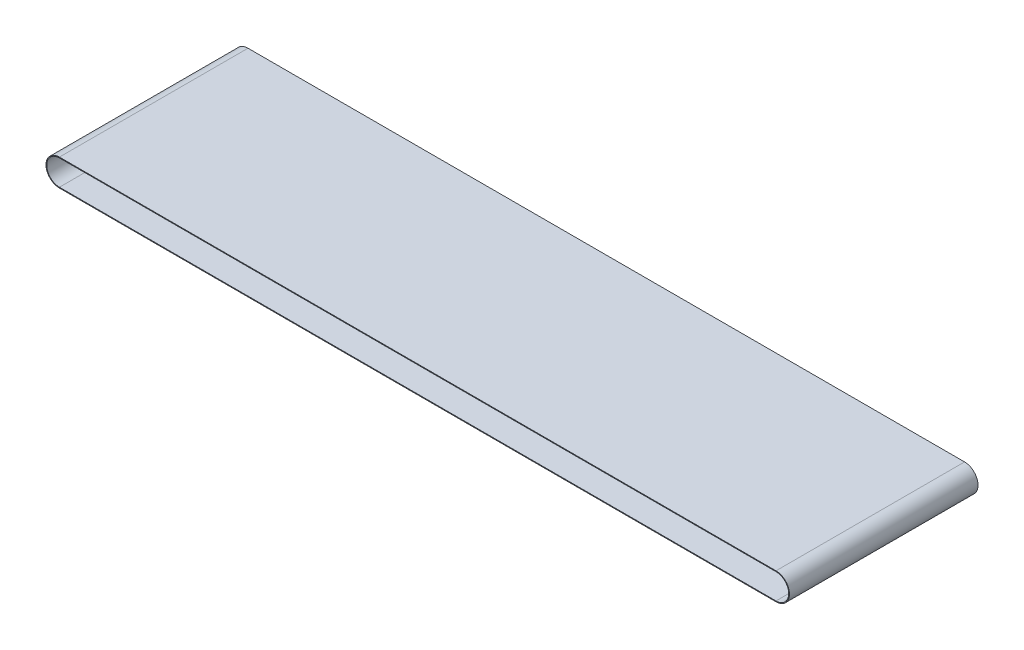
ISO-10303-21;
HEADER;
FILE_DESCRIPTION(('STEP AP214'),'2;1');
FILE_NAME('part.step','',(''),(''),'','','');
FILE_SCHEMA(('AUTOMOTIVE_DESIGN { 1 0 10303 214 1 1 1 1 }'));
ENDSEC;
DATA;
#1=APPLICATION_CONTEXT('core data for automotive mechanical design processes');
#2=APPLICATION_PROTOCOL_DEFINITION('international standard','automotive_design',2000,#1);
#3=PRODUCT_CONTEXT('',#1,'mechanical');
#4=PRODUCT('Part','Part','',(#3));
#5=PRODUCT_RELATED_PRODUCT_CATEGORY('part','',(#4));
#6=PRODUCT_DEFINITION_FORMATION('','',#4);
#7=PRODUCT_DEFINITION_CONTEXT('part definition',#1,'design');
#8=PRODUCT_DEFINITION('design','',#6,#7);
#9=PRODUCT_DEFINITION_SHAPE('','',#8);
#10=(LENGTH_UNIT() NAMED_UNIT(*) SI_UNIT(.MILLI.,.METRE.));
#11=(NAMED_UNIT(*) PLANE_ANGLE_UNIT() SI_UNIT($,.RADIAN.));
#12=(NAMED_UNIT(*) SI_UNIT($,.STERADIAN.) SOLID_ANGLE_UNIT());
#13=UNCERTAINTY_MEASURE_WITH_UNIT(LENGTH_MEASURE(1.E-05),#10,'distance_accuracy_value','');
#14=(GEOMETRIC_REPRESENTATION_CONTEXT(3) GLOBAL_UNCERTAINTY_ASSIGNED_CONTEXT((#13)) GLOBAL_UNIT_ASSIGNED_CONTEXT((#10,
#11,#12)) REPRESENTATION_CONTEXT('',''));
#15=CARTESIAN_POINT('',(0.,0.,0.));
#16=DIRECTION('',(0.,0.,1.));
#17=DIRECTION('',(1.,0.,0.));
#18=AXIS2_PLACEMENT_3D('',#15,#16,#17);
#19=CARTESIAN_POINT('',(0.,0.,-255.));
#20=DIRECTION('',(0.,0.,-1.));
#21=DIRECTION('',(-1.,0.,0.));
#22=AXIS2_PLACEMENT_3D('',#19,#20,#21);
#23=PLANE('',#22);
#24=CARTESIAN_POINT('',(0.,0.,-255.));
#25=DIRECTION('',(0.,0.,-1.));
#26=DIRECTION('',(-1.,0.,0.));
#27=AXIS2_PLACEMENT_3D('',#24,#25,#26);
#28=CIRCLE('',#27,17.8);
#29=CARTESIAN_POINT('',(0.,-17.8,-255.));
#30=VERTEX_POINT('',#29);
#31=CARTESIAN_POINT('',(0.,17.8,-255.));
#32=VERTEX_POINT('',#31);
#33=EDGE_CURVE('E168',#30,#32,#28,.T.);
#34=ORIENTED_EDGE('',*,*,#33,.T.);
#35=DIRECTION('',(1.,0.,0.));
#36=VECTOR('',#35,1.);
#37=CARTESIAN_POINT('',(0.,17.8,-255.));
#38=LINE('',#37,#36);
#39=CARTESIAN_POINT('',(950.,17.8,-255.));
#40=VERTEX_POINT('',#39);
#41=EDGE_CURVE('E171',#32,#40,#38,.T.);
#42=ORIENTED_EDGE('',*,*,#41,.T.);
#43=CARTESIAN_POINT('',(950.,0.,-255.));
#44=DIRECTION('',(0.,0.,-1.));
#45=DIRECTION('',(-1.,0.,0.));
#46=AXIS2_PLACEMENT_3D('',#43,#44,#45);
#47=CIRCLE('',#46,17.8);
#48=CARTESIAN_POINT('',(950.,-17.8,-255.));
#49=VERTEX_POINT('',#48);
#50=EDGE_CURVE('E174',#40,#49,#47,.T.);
#51=ORIENTED_EDGE('',*,*,#50,.T.);
#52=DIRECTION('',(-1.,0.,0.));
#53=VECTOR('',#52,1.);
#54=CARTESIAN_POINT('',(0.,-17.8,-255.));
#55=LINE('',#54,#53);
#56=EDGE_CURVE('E176',#49,#30,#55,.T.);
#57=ORIENTED_EDGE('',*,*,#56,.T.);
#58=EDGE_LOOP('',(#34,#42,#51,#57));
#59=FACE_BOUND('',#58,.T.);
#60=DIRECTION('',(1.,0.,0.));
#61=VECTOR('',#60,1.);
#62=CARTESIAN_POINT('',(0.,16.8,-255.));
#63=LINE('',#62,#61);
#64=CARTESIAN_POINT('',(0.,16.8,-255.));
#65=VERTEX_POINT('',#64);
#66=CARTESIAN_POINT('',(950.,16.8,-255.));
#67=VERTEX_POINT('',#66);
#68=EDGE_CURVE('E140',#65,#67,#63,.T.);
#69=ORIENTED_EDGE('',*,*,#68,.F.);
#70=CARTESIAN_POINT('',(0.,0.,-255.));
#71=DIRECTION('',(0.,0.,-1.));
#72=DIRECTION('',(-1.,0.,0.));
#73=AXIS2_PLACEMENT_3D('',#70,#71,#72);
#74=CIRCLE('',#73,16.8);
#75=CARTESIAN_POINT('',(0.,-16.8,-255.));
#76=VERTEX_POINT('',#75);
#77=EDGE_CURVE('E132',#76,#65,#74,.T.);
#78=ORIENTED_EDGE('',*,*,#77,.F.);
#79=DIRECTION('',(-1.,0.,0.));
#80=VECTOR('',#79,1.);
#81=CARTESIAN_POINT('',(950.,-16.8,-255.));
#82=LINE('',#81,#80);
#83=CARTESIAN_POINT('',(950.,-16.8,-255.));
#84=VERTEX_POINT('',#83);
#85=EDGE_CURVE('E154',#84,#76,#82,.T.);
#86=ORIENTED_EDGE('',*,*,#85,.F.);
#87=CARTESIAN_POINT('',(950.,0.,-255.));
#88=DIRECTION('',(0.,0.,-1.));
#89=DIRECTION('',(-1.,0.,0.));
#90=AXIS2_PLACEMENT_3D('',#87,#88,#89);
#91=CIRCLE('',#90,16.8);
#92=EDGE_CURVE('E152',#67,#84,#91,.T.);
#93=ORIENTED_EDGE('',*,*,#92,.F.);
#94=EDGE_LOOP('',(#69,#78,#86,#93));
#95=FACE_BOUND('',#94,.T.);
#96=ADVANCED_FACE('F67',(#59,#95),#23,.T.);
#97=CARTESIAN_POINT('',(0.,0.,-5.));
#98=DIRECTION('',(0.,0.,-1.));
#99=DIRECTION('',(-1.,0.,0.));
#100=AXIS2_PLACEMENT_3D('',#97,#98,#99);
#101=PLANE('',#100);
#102=CARTESIAN_POINT('',(0.,0.,-5.));
#103=DIRECTION('',(0.,0.,-1.));
#104=DIRECTION('',(-1.,0.,0.));
#105=AXIS2_PLACEMENT_3D('',#102,#103,#104);
#106=CIRCLE('',#105,17.8);
#107=CARTESIAN_POINT('',(0.,-17.8,-5.));
#108=VERTEX_POINT('',#107);
#109=CARTESIAN_POINT('',(0.,17.8,-5.));
#110=VERTEX_POINT('',#109);
#111=EDGE_CURVE('E148',#108,#110,#106,.T.);
#112=ORIENTED_EDGE('',*,*,#111,.F.);
#113=DIRECTION('',(-1.,0.,0.));
#114=VECTOR('',#113,1.);
#115=CARTESIAN_POINT('',(0.,-17.8,-5.));
#116=LINE('',#115,#114);
#117=CARTESIAN_POINT('',(950.,-17.8,-5.));
#118=VERTEX_POINT('',#117);
#119=EDGE_CURVE('E172',#118,#108,#116,.T.);
#120=ORIENTED_EDGE('',*,*,#119,.F.);
#121=CARTESIAN_POINT('',(950.,0.,-5.));
#122=DIRECTION('',(0.,0.,-1.));
#123=DIRECTION('',(-1.,0.,0.));
#124=AXIS2_PLACEMENT_3D('',#121,#122,#123);
#125=CIRCLE('',#124,17.8);
#126=CARTESIAN_POINT('',(950.,17.8,-5.));
#127=VERTEX_POINT('',#126);
#128=EDGE_CURVE('E183',#127,#118,#125,.T.);
#129=ORIENTED_EDGE('',*,*,#128,.F.);
#130=DIRECTION('',(1.,0.,0.));
#131=VECTOR('',#130,1.);
#132=CARTESIAN_POINT('',(0.,17.8,-5.));
#133=LINE('',#132,#131);
#134=EDGE_CURVE('E181',#110,#127,#133,.T.);
#135=ORIENTED_EDGE('',*,*,#134,.F.);
#136=EDGE_LOOP('',(#112,#120,#129,#135));
#137=FACE_BOUND('',#136,.T.);
#138=CARTESIAN_POINT('',(0.,0.,-5.));
#139=DIRECTION('',(0.,0.,-1.));
#140=DIRECTION('',(-1.,0.,0.));
#141=AXIS2_PLACEMENT_3D('',#138,#139,#140);
#142=CIRCLE('',#141,16.8);
#143=CARTESIAN_POINT('',(0.,-16.8,-5.));
#144=VERTEX_POINT('',#143);
#145=CARTESIAN_POINT('',(0.,16.8,-5.));
#146=VERTEX_POINT('',#145);
#147=EDGE_CURVE('E90',#144,#146,#142,.T.);
#148=ORIENTED_EDGE('',*,*,#147,.T.);
#149=DIRECTION('',(1.,0.,0.));
#150=VECTOR('',#149,1.);
#151=CARTESIAN_POINT('',(0.,16.8,-5.));
#152=LINE('',#151,#150);
#153=CARTESIAN_POINT('',(950.,16.8,-5.));
#154=VERTEX_POINT('',#153);
#155=EDGE_CURVE('E147',#146,#154,#152,.T.);
#156=ORIENTED_EDGE('',*,*,#155,.T.);
#157=CARTESIAN_POINT('',(950.,0.,-5.));
#158=DIRECTION('',(0.,0.,-1.));
#159=DIRECTION('',(-1.,0.,0.));
#160=AXIS2_PLACEMENT_3D('',#157,#158,#159);
#161=CIRCLE('',#160,16.8);
#162=CARTESIAN_POINT('',(950.,-16.8,-5.));
#163=VERTEX_POINT('',#162);
#164=EDGE_CURVE('E160',#154,#163,#161,.T.);
#165=ORIENTED_EDGE('',*,*,#164,.T.);
#166=DIRECTION('',(-1.,0.,0.));
#167=VECTOR('',#166,1.);
#168=CARTESIAN_POINT('',(950.,-16.8,-5.));
#169=LINE('',#168,#167);
#170=EDGE_CURVE('E141',#163,#144,#169,.T.);
#171=ORIENTED_EDGE('',*,*,#170,.T.);
#172=EDGE_LOOP('',(#148,#156,#165,#171));
#173=FACE_BOUND('',#172,.T.);
#174=ADVANCED_FACE('F201',(#137,#173),#101,.F.);
#175=CARTESIAN_POINT('',(0.,0.,-255.));
#176=DIRECTION('',(0.,0.,1.));
#177=DIRECTION('',(1.,0.,0.));
#178=AXIS2_PLACEMENT_3D('',#175,#176,#177);
#179=CYLINDRICAL_SURFACE('',#178,17.8);
#180=ORIENTED_EDGE('',*,*,#111,.T.);
#181=DIRECTION('',(0.,0.,1.));
#182=VECTOR('',#181,1.);
#183=CARTESIAN_POINT('',(0.,17.8,-255.));
#184=LINE('',#183,#182);
#185=EDGE_CURVE('E12',#32,#110,#184,.T.);
#186=ORIENTED_EDGE('',*,*,#185,.F.);
#187=ORIENTED_EDGE('',*,*,#33,.F.);
#188=DIRECTION('',(0.,0.,1.));
#189=VECTOR('',#188,1.);
#190=CARTESIAN_POINT('',(0.,-17.8,-255.));
#191=LINE('',#190,#189);
#192=EDGE_CURVE('E178',#30,#108,#191,.T.);
#193=ORIENTED_EDGE('',*,*,#192,.T.);
#194=EDGE_LOOP('',(#180,#186,#187,#193));
#195=FACE_BOUND('',#194,.T.);
#196=ADVANCED_FACE('F69',(#195),#179,.T.);
#197=CARTESIAN_POINT('',(0.,17.8,-255.));
#198=DIRECTION('',(0.,-1.,0.));
#199=DIRECTION('',(0.,0.,-1.));
#200=AXIS2_PLACEMENT_3D('',#197,#198,#199);
#201=PLANE('',#200);
#202=ORIENTED_EDGE('',*,*,#134,.T.);
#203=DIRECTION('',(0.,0.,1.));
#204=VECTOR('',#203,1.);
#205=CARTESIAN_POINT('',(950.,17.8,-255.));
#206=LINE('',#205,#204);
#207=EDGE_CURVE('E75',#40,#127,#206,.T.);
#208=ORIENTED_EDGE('',*,*,#207,.F.);
#209=ORIENTED_EDGE('',*,*,#41,.F.);
#210=ORIENTED_EDGE('',*,*,#185,.T.);
#211=EDGE_LOOP('',(#202,#208,#209,#210));
#212=FACE_BOUND('',#211,.T.);
#213=ADVANCED_FACE('F211',(#212),#201,.F.);
#214=CARTESIAN_POINT('',(950.,0.,-255.));
#215=DIRECTION('',(0.,0.,1.));
#216=DIRECTION('',(1.,0.,0.));
#217=AXIS2_PLACEMENT_3D('',#214,#215,#216);
#218=CYLINDRICAL_SURFACE('',#217,17.8);
#219=ORIENTED_EDGE('',*,*,#128,.T.);
#220=DIRECTION('',(0.,0.,1.));
#221=VECTOR('',#220,1.);
#222=CARTESIAN_POINT('',(950.,-17.8,-255.));
#223=LINE('',#222,#221);
#224=EDGE_CURVE('E188',#49,#118,#223,.T.);
#225=ORIENTED_EDGE('',*,*,#224,.F.);
#226=ORIENTED_EDGE('',*,*,#50,.F.);
#227=ORIENTED_EDGE('',*,*,#207,.T.);
#228=EDGE_LOOP('',(#219,#225,#226,#227));
#229=FACE_BOUND('',#228,.T.);
#230=ADVANCED_FACE('F195',(#229),#218,.T.);
#231=CARTESIAN_POINT('',(0.,-17.8,-255.));
#232=DIRECTION('',(0.,1.,0.));
#233=DIRECTION('',(0.,0.,1.));
#234=AXIS2_PLACEMENT_3D('',#231,#232,#233);
#235=PLANE('',#234);
#236=ORIENTED_EDGE('',*,*,#119,.T.);
#237=ORIENTED_EDGE('',*,*,#192,.F.);
#238=ORIENTED_EDGE('',*,*,#56,.F.);
#239=ORIENTED_EDGE('',*,*,#224,.T.);
#240=EDGE_LOOP('',(#236,#237,#238,#239));
#241=FACE_BOUND('',#240,.T.);
#242=ADVANCED_FACE('F205',(#241),#235,.F.);
#243=CARTESIAN_POINT('',(0.,0.,-255.));
#244=DIRECTION('',(0.,0.,1.));
#245=DIRECTION('',(1.,0.,0.));
#246=AXIS2_PLACEMENT_3D('',#243,#244,#245);
#247=CYLINDRICAL_SURFACE('',#246,16.8);
#248=ORIENTED_EDGE('',*,*,#147,.F.);
#249=DIRECTION('',(0.,0.,1.));
#250=VECTOR('',#249,1.);
#251=CARTESIAN_POINT('',(0.,-16.8,-255.));
#252=LINE('',#251,#250);
#253=EDGE_CURVE('E136',#76,#144,#252,.T.);
#254=ORIENTED_EDGE('',*,*,#253,.F.);
#255=ORIENTED_EDGE('',*,*,#77,.T.);
#256=DIRECTION('',(0.,0.,1.));
#257=VECTOR('',#256,1.);
#258=CARTESIAN_POINT('',(0.,16.8,-255.));
#259=LINE('',#258,#257);
#260=EDGE_CURVE('E135',#65,#146,#259,.T.);
#261=ORIENTED_EDGE('',*,*,#260,.T.);
#262=EDGE_LOOP('',(#248,#254,#255,#261));
#263=FACE_BOUND('',#262,.T.);
#264=ADVANCED_FACE('F134',(#263),#247,.F.);
#265=CARTESIAN_POINT('',(0.,16.8,-255.));
#266=DIRECTION('',(0.,-1.,0.));
#267=DIRECTION('',(0.,0.,-1.));
#268=AXIS2_PLACEMENT_3D('',#265,#266,#267);
#269=PLANE('',#268);
#270=ORIENTED_EDGE('',*,*,#155,.F.);
#271=ORIENTED_EDGE('',*,*,#260,.F.);
#272=ORIENTED_EDGE('',*,*,#68,.T.);
#273=DIRECTION('',(0.,0.,1.));
#274=VECTOR('',#273,1.);
#275=CARTESIAN_POINT('',(950.,16.8,-255.));
#276=LINE('',#275,#274);
#277=EDGE_CURVE('E149',#67,#154,#276,.T.);
#278=ORIENTED_EDGE('',*,*,#277,.T.);
#279=EDGE_LOOP('',(#270,#271,#272,#278));
#280=FACE_BOUND('',#279,.T.);
#281=ADVANCED_FACE('F144',(#280),#269,.T.);
#282=CARTESIAN_POINT('',(950.,0.,-255.));
#283=DIRECTION('',(0.,0.,1.));
#284=DIRECTION('',(1.,0.,0.));
#285=AXIS2_PLACEMENT_3D('',#282,#283,#284);
#286=CYLINDRICAL_SURFACE('',#285,16.8);
#287=ORIENTED_EDGE('',*,*,#164,.F.);
#288=ORIENTED_EDGE('',*,*,#277,.F.);
#289=ORIENTED_EDGE('',*,*,#92,.T.);
#290=DIRECTION('',(0.,0.,1.));
#291=VECTOR('',#290,1.);
#292=CARTESIAN_POINT('',(950.,-16.8,-255.));
#293=LINE('',#292,#291);
#294=EDGE_CURVE('E82',#84,#163,#293,.T.);
#295=ORIENTED_EDGE('',*,*,#294,.T.);
#296=EDGE_LOOP('',(#287,#288,#289,#295));
#297=FACE_BOUND('',#296,.T.);
#298=ADVANCED_FACE('F234',(#297),#286,.F.);
#299=CARTESIAN_POINT('',(950.,-16.8,-255.));
#300=DIRECTION('',(0.,1.,0.));
#301=DIRECTION('',(0.,0.,1.));
#302=AXIS2_PLACEMENT_3D('',#299,#300,#301);
#303=PLANE('',#302);
#304=ORIENTED_EDGE('',*,*,#170,.F.);
#305=ORIENTED_EDGE('',*,*,#294,.F.);
#306=ORIENTED_EDGE('',*,*,#85,.T.);
#307=ORIENTED_EDGE('',*,*,#253,.T.);
#308=EDGE_LOOP('',(#304,#305,#306,#307));
#309=FACE_BOUND('',#308,.T.);
#310=ADVANCED_FACE('F238',(#309),#303,.T.);
#311=CLOSED_SHELL('',(#96,#174,#196,#213,#230,#242,#264,#281,#298,#310));
#312=MANIFOLD_SOLID_BREP('B2',#311);
#313=ADVANCED_BREP_SHAPE_REPRESENTATION('',(#18,#312),#14);
#314=SHAPE_DEFINITION_REPRESENTATION(#9,#313);
ENDSEC;
END-ISO-10303-21;
